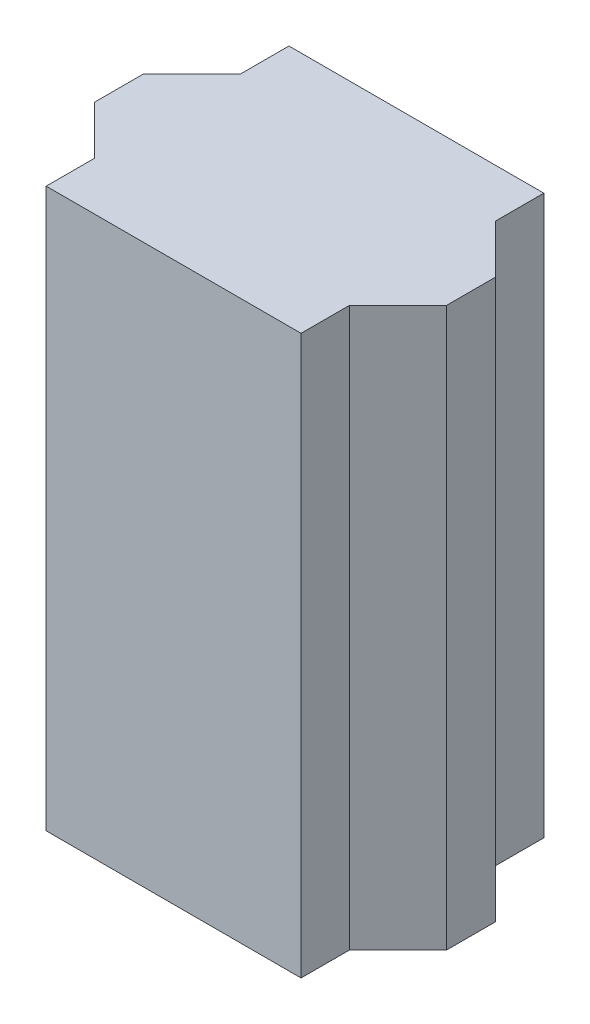
ISO-10303-21;
HEADER;
FILE_DESCRIPTION(('STEP AP214'),'2;1');
FILE_NAME('part.step','',(''),(''),'','','');
FILE_SCHEMA(('AUTOMOTIVE_DESIGN { 1 0 10303 214 1 1 1 1 }'));
ENDSEC;
DATA;
#1=APPLICATION_CONTEXT('core data for automotive mechanical design processes');
#2=APPLICATION_PROTOCOL_DEFINITION('international standard','automotive_design',2000,#1);
#3=PRODUCT_CONTEXT('',#1,'mechanical');
#4=PRODUCT('Part','Part','',(#3));
#5=PRODUCT_RELATED_PRODUCT_CATEGORY('part','',(#4));
#6=PRODUCT_DEFINITION_FORMATION('','',#4);
#7=PRODUCT_DEFINITION_CONTEXT('part definition',#1,'design');
#8=PRODUCT_DEFINITION('design','',#6,#7);
#9=PRODUCT_DEFINITION_SHAPE('','',#8);
#10=(LENGTH_UNIT() NAMED_UNIT(*) SI_UNIT(.MILLI.,.METRE.));
#11=(NAMED_UNIT(*) PLANE_ANGLE_UNIT() SI_UNIT($,.RADIAN.));
#12=(NAMED_UNIT(*) SI_UNIT($,.STERADIAN.) SOLID_ANGLE_UNIT());
#13=UNCERTAINTY_MEASURE_WITH_UNIT(LENGTH_MEASURE(1.E-05),#10,'distance_accuracy_value','');
#14=(GEOMETRIC_REPRESENTATION_CONTEXT(3) GLOBAL_UNCERTAINTY_ASSIGNED_CONTEXT((#13)) GLOBAL_UNIT_ASSIGNED_CONTEXT((#10,
#11,#12)) REPRESENTATION_CONTEXT('',''));
#15=CARTESIAN_POINT('',(0.,0.,0.));
#16=DIRECTION('',(0.,0.,1.));
#17=DIRECTION('',(1.,0.,0.));
#18=AXIS2_PLACEMENT_3D('',#15,#16,#17);
#19=CARTESIAN_POINT('',(5.24999999999998,28.,18.));
#20=DIRECTION('',(-1.,0.,0.));
#21=DIRECTION('',(0.,0.,1.));
#22=AXIS2_PLACEMENT_3D('',#19,#20,#21);
#23=PLANE('',#22);
#24=DIRECTION('',(0.,0.,-1.));
#25=VECTOR('',#24,1.);
#26=CARTESIAN_POINT('',(5.24999999999998,5.,18.));
#27=LINE('',#26,#25);
#28=CARTESIAN_POINT('',(5.24999999999998,5.,20.));
#29=VERTEX_POINT('',#28);
#30=CARTESIAN_POINT('',(5.24999999999998,5.,18.));
#31=VERTEX_POINT('',#30);
#32=EDGE_CURVE('E153',#29,#31,#27,.T.);
#33=ORIENTED_EDGE('',*,*,#32,.T.);
#34=DIRECTION('',(0.,-1.,0.));
#35=VECTOR('',#34,1.);
#36=CARTESIAN_POINT('',(5.24999999999998,28.,18.));
#37=LINE('',#36,#35);
#38=CARTESIAN_POINT('',(5.24999999999998,28.,18.));
#39=VERTEX_POINT('',#38);
#40=EDGE_CURVE('E11',#39,#31,#37,.T.);
#41=ORIENTED_EDGE('',*,*,#40,.F.);
#42=DIRECTION('',(0.,0.,-1.));
#43=VECTOR('',#42,1.);
#44=CARTESIAN_POINT('',(5.24999999999998,28.,18.));
#45=LINE('',#44,#43);
#46=CARTESIAN_POINT('',(5.24999999999998,28.,20.));
#47=VERTEX_POINT('',#46);
#48=EDGE_CURVE('E175',#47,#39,#45,.T.);
#49=ORIENTED_EDGE('',*,*,#48,.F.);
#50=DIRECTION('',(0.,-1.,0.));
#51=VECTOR('',#50,1.);
#52=CARTESIAN_POINT('',(5.24999999999998,28.,20.));
#53=LINE('',#52,#51);
#54=EDGE_CURVE('E149',#47,#29,#53,.T.);
#55=ORIENTED_EDGE('',*,*,#54,.T.);
#56=EDGE_LOOP('',(#33,#41,#49,#55));
#57=FACE_BOUND('',#56,.T.);
#58=ADVANCED_FACE('F33',(#57),#23,.F.);
#59=CARTESIAN_POINT('',(-5.25000000000001,28.,18.));
#60=DIRECTION('',(0.,0.,1.));
#61=DIRECTION('',(1.,0.,0.));
#62=AXIS2_PLACEMENT_3D('',#59,#60,#61);
#63=PLANE('',#62);
#64=DIRECTION('',(-1.,0.,0.));
#65=VECTOR('',#64,1.);
#66=CARTESIAN_POINT('',(-5.25000000000001,5.,18.));
#67=LINE('',#66,#65);
#68=CARTESIAN_POINT('',(-5.25000000000001,5.,18.));
#69=VERTEX_POINT('',#68);
#70=EDGE_CURVE('E156',#31,#69,#67,.T.);
#71=ORIENTED_EDGE('',*,*,#70,.T.);
#72=DIRECTION('',(0.,-1.,0.));
#73=VECTOR('',#72,1.);
#74=CARTESIAN_POINT('',(-5.25000000000001,28.,18.));
#75=LINE('',#74,#73);
#76=CARTESIAN_POINT('',(-5.25000000000001,28.,18.));
#77=VERTEX_POINT('',#76);
#78=EDGE_CURVE('E41',#77,#69,#75,.T.);
#79=ORIENTED_EDGE('',*,*,#78,.F.);
#80=DIRECTION('',(-1.,0.,0.));
#81=VECTOR('',#80,1.);
#82=CARTESIAN_POINT('',(-5.25000000000001,28.,18.));
#83=LINE('',#82,#81);
#84=EDGE_CURVE('E104',#39,#77,#83,.T.);
#85=ORIENTED_EDGE('',*,*,#84,.F.);
#86=ORIENTED_EDGE('',*,*,#40,.T.);
#87=EDGE_LOOP('',(#71,#79,#85,#86));
#88=FACE_BOUND('',#87,.T.);
#89=ADVANCED_FACE('F253',(#88),#63,.F.);
#90=CARTESIAN_POINT('',(-5.25,28.,20.));
#91=DIRECTION('',(1.,0.,0.));
#92=DIRECTION('',(0.,0.,-1.));
#93=AXIS2_PLACEMENT_3D('',#90,#91,#92);
#94=PLANE('',#93);
#95=DIRECTION('',(0.,0.,1.));
#96=VECTOR('',#95,1.);
#97=CARTESIAN_POINT('',(-5.25,5.,20.));
#98=LINE('',#97,#96);
#99=CARTESIAN_POINT('',(-5.25,5.,20.));
#100=VERTEX_POINT('',#99);
#101=EDGE_CURVE('E158',#69,#100,#98,.T.);
#102=ORIENTED_EDGE('',*,*,#101,.T.);
#103=DIRECTION('',(0.,-1.,0.));
#104=VECTOR('',#103,1.);
#105=CARTESIAN_POINT('',(-5.25,28.,20.));
#106=LINE('',#105,#104);
#107=CARTESIAN_POINT('',(-5.25,28.,20.));
#108=VERTEX_POINT('',#107);
#109=EDGE_CURVE('E194',#108,#100,#106,.T.);
#110=ORIENTED_EDGE('',*,*,#109,.F.);
#111=DIRECTION('',(0.,0.,1.));
#112=VECTOR('',#111,1.);
#113=CARTESIAN_POINT('',(-5.25,28.,20.));
#114=LINE('',#113,#112);
#115=EDGE_CURVE('E202',#77,#108,#114,.T.);
#116=ORIENTED_EDGE('',*,*,#115,.F.);
#117=ORIENTED_EDGE('',*,*,#78,.T.);
#118=EDGE_LOOP('',(#102,#110,#116,#117));
#119=FACE_BOUND('',#118,.T.);
#120=ADVANCED_FACE('F200',(#119),#94,.F.);
#121=CARTESIAN_POINT('',(-7.25,28.,22.));
#122=DIRECTION('',(0.70710678118655,0.,0.707106781186545));
#123=DIRECTION('',(0.707106781186545,0.,-0.70710678118655));
#124=AXIS2_PLACEMENT_3D('',#121,#122,#123);
#125=PLANE('',#124);
#126=DIRECTION('',(-0.707106781186545,0.,0.70710678118655));
#127=VECTOR('',#126,1.);
#128=CARTESIAN_POINT('',(-7.25,5.,22.));
#129=LINE('',#128,#127);
#130=CARTESIAN_POINT('',(-7.25,5.,22.));
#131=VERTEX_POINT('',#130);
#132=EDGE_CURVE('E160',#100,#131,#129,.T.);
#133=ORIENTED_EDGE('',*,*,#132,.T.);
#134=DIRECTION('',(0.,-1.,0.));
#135=VECTOR('',#134,1.);
#136=CARTESIAN_POINT('',(-7.25,28.,22.));
#137=LINE('',#136,#135);
#138=CARTESIAN_POINT('',(-7.25,28.,22.));
#139=VERTEX_POINT('',#138);
#140=EDGE_CURVE('E191',#139,#131,#137,.T.);
#141=ORIENTED_EDGE('',*,*,#140,.F.);
#142=DIRECTION('',(-0.707106781186545,0.,0.70710678118655));
#143=VECTOR('',#142,1.);
#144=CARTESIAN_POINT('',(-7.25,28.,22.));
#145=LINE('',#144,#143);
#146=EDGE_CURVE('E220',#108,#139,#145,.T.);
#147=ORIENTED_EDGE('',*,*,#146,.F.);
#148=ORIENTED_EDGE('',*,*,#109,.T.);
#149=EDGE_LOOP('',(#133,#141,#147,#148));
#150=FACE_BOUND('',#149,.T.);
#151=ADVANCED_FACE('F211',(#150),#125,.F.);
#152=CARTESIAN_POINT('',(-7.25,28.,24.));
#153=DIRECTION('',(1.,0.,0.));
#154=DIRECTION('',(0.,0.,-1.));
#155=AXIS2_PLACEMENT_3D('',#152,#153,#154);
#156=PLANE('',#155);
#157=DIRECTION('',(0.,0.,1.));
#158=VECTOR('',#157,1.);
#159=CARTESIAN_POINT('',(-7.25,5.,24.));
#160=LINE('',#159,#158);
#161=CARTESIAN_POINT('',(-7.25,5.,24.));
#162=VERTEX_POINT('',#161);
#163=EDGE_CURVE('E162',#131,#162,#160,.T.);
#164=ORIENTED_EDGE('',*,*,#163,.T.);
#165=DIRECTION('',(0.,-1.,0.));
#166=VECTOR('',#165,1.);
#167=CARTESIAN_POINT('',(-7.25,28.,24.));
#168=LINE('',#167,#166);
#169=CARTESIAN_POINT('',(-7.25,28.,24.));
#170=VERTEX_POINT('',#169);
#171=EDGE_CURVE('E188',#170,#162,#168,.T.);
#172=ORIENTED_EDGE('',*,*,#171,.F.);
#173=DIRECTION('',(0.,0.,1.));
#174=VECTOR('',#173,1.);
#175=CARTESIAN_POINT('',(-7.25,28.,24.));
#176=LINE('',#175,#174);
#177=EDGE_CURVE('E217',#139,#170,#176,.T.);
#178=ORIENTED_EDGE('',*,*,#177,.F.);
#179=ORIENTED_EDGE('',*,*,#140,.T.);
#180=EDGE_LOOP('',(#164,#172,#178,#179));
#181=FACE_BOUND('',#180,.T.);
#182=ADVANCED_FACE('F215',(#181),#156,.F.);
#183=CARTESIAN_POINT('',(-5.25,28.,26.));
#184=DIRECTION('',(0.707106781186544,0.,-0.707106781186551));
#185=DIRECTION('',(-0.707106781186551,0.,-0.707106781186544));
#186=AXIS2_PLACEMENT_3D('',#183,#184,#185);
#187=PLANE('',#186);
#188=DIRECTION('',(0.707106781186551,0.,0.707106781186544));
#189=VECTOR('',#188,1.);
#190=CARTESIAN_POINT('',(-5.25,5.,26.));
#191=LINE('',#190,#189);
#192=CARTESIAN_POINT('',(-5.25,5.,26.));
#193=VERTEX_POINT('',#192);
#194=EDGE_CURVE('E164',#162,#193,#191,.T.);
#195=ORIENTED_EDGE('',*,*,#194,.T.);
#196=DIRECTION('',(0.,-1.,0.));
#197=VECTOR('',#196,1.);
#198=CARTESIAN_POINT('',(-5.25,28.,26.));
#199=LINE('',#198,#197);
#200=CARTESIAN_POINT('',(-5.25,28.,26.));
#201=VERTEX_POINT('',#200);
#202=EDGE_CURVE('E185',#201,#193,#199,.T.);
#203=ORIENTED_EDGE('',*,*,#202,.F.);
#204=DIRECTION('',(0.707106781186551,0.,0.707106781186544));
#205=VECTOR('',#204,1.);
#206=CARTESIAN_POINT('',(-5.25,28.,26.));
#207=LINE('',#206,#205);
#208=EDGE_CURVE('E219',#170,#201,#207,.T.);
#209=ORIENTED_EDGE('',*,*,#208,.F.);
#210=ORIENTED_EDGE('',*,*,#171,.T.);
#211=EDGE_LOOP('',(#195,#203,#209,#210));
#212=FACE_BOUND('',#211,.T.);
#213=ADVANCED_FACE('F266',(#212),#187,.F.);
#214=CARTESIAN_POINT('',(-5.25,28.,28.));
#215=DIRECTION('',(1.,0.,0.));
#216=DIRECTION('',(0.,0.,-1.));
#217=AXIS2_PLACEMENT_3D('',#214,#215,#216);
#218=PLANE('',#217);
#219=DIRECTION('',(0.,0.,1.));
#220=VECTOR('',#219,1.);
#221=CARTESIAN_POINT('',(-5.25,5.,28.));
#222=LINE('',#221,#220);
#223=CARTESIAN_POINT('',(-5.25,5.,28.));
#224=VERTEX_POINT('',#223);
#225=EDGE_CURVE('E166',#193,#224,#222,.T.);
#226=ORIENTED_EDGE('',*,*,#225,.T.);
#227=DIRECTION('',(0.,-1.,0.));
#228=VECTOR('',#227,1.);
#229=CARTESIAN_POINT('',(-5.25,28.,28.));
#230=LINE('',#229,#228);
#231=CARTESIAN_POINT('',(-5.25,28.,28.));
#232=VERTEX_POINT('',#231);
#233=EDGE_CURVE('E182',#232,#224,#230,.T.);
#234=ORIENTED_EDGE('',*,*,#233,.F.);
#235=DIRECTION('',(0.,0.,1.));
#236=VECTOR('',#235,1.);
#237=CARTESIAN_POINT('',(-5.25,28.,28.));
#238=LINE('',#237,#236);
#239=EDGE_CURVE('E222',#201,#232,#238,.T.);
#240=ORIENTED_EDGE('',*,*,#239,.F.);
#241=ORIENTED_EDGE('',*,*,#202,.T.);
#242=EDGE_LOOP('',(#226,#234,#240,#241));
#243=FACE_BOUND('',#242,.T.);
#244=ADVANCED_FACE('F269',(#243),#218,.F.);
#245=CARTESIAN_POINT('',(5.24999999999998,28.,28.));
#246=DIRECTION('',(0.,0.,-1.));
#247=DIRECTION('',(-1.,0.,0.));
#248=AXIS2_PLACEMENT_3D('',#245,#246,#247);
#249=PLANE('',#248);
#250=DIRECTION('',(1.,0.,0.));
#251=VECTOR('',#250,1.);
#252=CARTESIAN_POINT('',(5.24999999999998,5.,28.));
#253=LINE('',#252,#251);
#254=CARTESIAN_POINT('',(5.24999999999998,5.,28.));
#255=VERTEX_POINT('',#254);
#256=EDGE_CURVE('E168',#224,#255,#253,.T.);
#257=ORIENTED_EDGE('',*,*,#256,.T.);
#258=DIRECTION('',(0.,-1.,0.));
#259=VECTOR('',#258,1.);
#260=CARTESIAN_POINT('',(5.24999999999998,28.,28.));
#261=LINE('',#260,#259);
#262=CARTESIAN_POINT('',(5.24999999999998,28.,28.));
#263=VERTEX_POINT('',#262);
#264=EDGE_CURVE('E179',#263,#255,#261,.T.);
#265=ORIENTED_EDGE('',*,*,#264,.F.);
#266=DIRECTION('',(1.,0.,0.));
#267=VECTOR('',#266,1.);
#268=CARTESIAN_POINT('',(5.24999999999998,28.,28.));
#269=LINE('',#268,#267);
#270=EDGE_CURVE('E228',#232,#263,#269,.T.);
#271=ORIENTED_EDGE('',*,*,#270,.F.);
#272=ORIENTED_EDGE('',*,*,#233,.T.);
#273=EDGE_LOOP('',(#257,#265,#271,#272));
#274=FACE_BOUND('',#273,.T.);
#275=ADVANCED_FACE('F234',(#274),#249,.F.);
#276=CARTESIAN_POINT('',(5.24999999999998,28.,26.));
#277=DIRECTION('',(-1.,0.,0.));
#278=DIRECTION('',(0.,0.,1.));
#279=AXIS2_PLACEMENT_3D('',#276,#277,#278);
#280=PLANE('',#279);
#281=DIRECTION('',(0.,0.,-1.));
#282=VECTOR('',#281,1.);
#283=CARTESIAN_POINT('',(5.24999999999998,5.,26.));
#284=LINE('',#283,#282);
#285=CARTESIAN_POINT('',(5.24999999999998,5.,26.));
#286=VERTEX_POINT('',#285);
#287=EDGE_CURVE('E170',#255,#286,#284,.T.);
#288=ORIENTED_EDGE('',*,*,#287,.T.);
#289=DIRECTION('',(0.,-1.,0.));
#290=VECTOR('',#289,1.);
#291=CARTESIAN_POINT('',(5.24999999999998,28.,26.));
#292=LINE('',#291,#290);
#293=CARTESIAN_POINT('',(5.24999999999998,28.,26.));
#294=VERTEX_POINT('',#293);
#295=EDGE_CURVE('E144',#294,#286,#292,.T.);
#296=ORIENTED_EDGE('',*,*,#295,.F.);
#297=DIRECTION('',(0.,0.,-1.));
#298=VECTOR('',#297,1.);
#299=CARTESIAN_POINT('',(5.24999999999998,28.,26.));
#300=LINE('',#299,#298);
#301=EDGE_CURVE('E135',#263,#294,#300,.T.);
#302=ORIENTED_EDGE('',*,*,#301,.F.);
#303=ORIENTED_EDGE('',*,*,#264,.T.);
#304=EDGE_LOOP('',(#288,#296,#302,#303));
#305=FACE_BOUND('',#304,.T.);
#306=ADVANCED_FACE('F238',(#305),#280,.F.);
#307=CARTESIAN_POINT('',(7.25,28.,24.));
#308=DIRECTION('',(-0.707106781186542,0.,-0.707106781186553));
#309=DIRECTION('',(-0.707106781186553,0.,0.707106781186542));
#310=AXIS2_PLACEMENT_3D('',#307,#308,#309);
#311=PLANE('',#310);
#312=DIRECTION('',(0.707106781186553,0.,-0.707106781186542));
#313=VECTOR('',#312,1.);
#314=CARTESIAN_POINT('',(7.25,5.,24.));
#315=LINE('',#314,#313);
#316=CARTESIAN_POINT('',(7.25,5.,24.));
#317=VERTEX_POINT('',#316);
#318=EDGE_CURVE('E143',#286,#317,#315,.T.);
#319=ORIENTED_EDGE('',*,*,#318,.T.);
#320=DIRECTION('',(0.,-1.,0.));
#321=VECTOR('',#320,1.);
#322=CARTESIAN_POINT('',(7.25,28.,24.));
#323=LINE('',#322,#321);
#324=CARTESIAN_POINT('',(7.25,28.,24.));
#325=VERTEX_POINT('',#324);
#326=EDGE_CURVE('E140',#325,#317,#323,.T.);
#327=ORIENTED_EDGE('',*,*,#326,.F.);
#328=DIRECTION('',(0.707106781186553,0.,-0.707106781186542));
#329=VECTOR('',#328,1.);
#330=CARTESIAN_POINT('',(7.25,28.,24.));
#331=LINE('',#330,#329);
#332=EDGE_CURVE('E129',#294,#325,#331,.T.);
#333=ORIENTED_EDGE('',*,*,#332,.F.);
#334=ORIENTED_EDGE('',*,*,#295,.T.);
#335=EDGE_LOOP('',(#319,#327,#333,#334));
#336=FACE_BOUND('',#335,.T.);
#337=ADVANCED_FACE('F141',(#336),#311,.F.);
#338=CARTESIAN_POINT('',(7.25,28.,22.));
#339=DIRECTION('',(-1.,0.,0.));
#340=DIRECTION('',(0.,0.,1.));
#341=AXIS2_PLACEMENT_3D('',#338,#339,#340);
#342=PLANE('',#341);
#343=DIRECTION('',(0.,0.,-1.));
#344=VECTOR('',#343,1.);
#345=CARTESIAN_POINT('',(7.25,5.,22.));
#346=LINE('',#345,#344);
#347=CARTESIAN_POINT('',(7.25,5.,22.));
#348=VERTEX_POINT('',#347);
#349=EDGE_CURVE('E90',#317,#348,#346,.T.);
#350=ORIENTED_EDGE('',*,*,#349,.T.);
#351=DIRECTION('',(0.,-1.,0.));
#352=VECTOR('',#351,1.);
#353=CARTESIAN_POINT('',(7.25,28.,22.));
#354=LINE('',#353,#352);
#355=CARTESIAN_POINT('',(7.25,28.,22.));
#356=VERTEX_POINT('',#355);
#357=EDGE_CURVE('E145',#356,#348,#354,.T.);
#358=ORIENTED_EDGE('',*,*,#357,.F.);
#359=DIRECTION('',(0.,0.,-1.));
#360=VECTOR('',#359,1.);
#361=CARTESIAN_POINT('',(7.25,28.,22.));
#362=LINE('',#361,#360);
#363=EDGE_CURVE('E133',#325,#356,#362,.T.);
#364=ORIENTED_EDGE('',*,*,#363,.F.);
#365=ORIENTED_EDGE('',*,*,#326,.T.);
#366=EDGE_LOOP('',(#350,#358,#364,#365));
#367=FACE_BOUND('',#366,.T.);
#368=ADVANCED_FACE('F147',(#367),#342,.F.);
#369=CARTESIAN_POINT('',(5.24999999999998,28.,20.));
#370=DIRECTION('',(-0.707106781186543,0.,0.707106781186552));
#371=DIRECTION('',(0.707106781186552,0.,0.707106781186543));
#372=AXIS2_PLACEMENT_3D('',#369,#370,#371);
#373=PLANE('',#372);
#374=DIRECTION('',(-0.707106781186553,0.,-0.707106781186543));
#375=VECTOR('',#374,1.);
#376=CARTESIAN_POINT('',(5.24999999999998,5.,20.));
#377=LINE('',#376,#375);
#378=EDGE_CURVE('E96',#348,#29,#377,.T.);
#379=ORIENTED_EDGE('',*,*,#378,.T.);
#380=ORIENTED_EDGE('',*,*,#54,.F.);
#381=DIRECTION('',(-0.707106781186553,0.,-0.707106781186543));
#382=VECTOR('',#381,1.);
#383=CARTESIAN_POINT('',(5.24999999999998,28.,20.));
#384=LINE('',#383,#382);
#385=EDGE_CURVE('E49',#356,#47,#384,.T.);
#386=ORIENTED_EDGE('',*,*,#385,.F.);
#387=ORIENTED_EDGE('',*,*,#357,.T.);
#388=EDGE_LOOP('',(#379,#380,#386,#387));
#389=FACE_BOUND('',#388,.T.);
#390=ADVANCED_FACE('F242',(#389),#373,.F.);
#391=CARTESIAN_POINT('',(0.,28.,0.));
#392=DIRECTION('',(0.,-1.,0.));
#393=DIRECTION('',(0.,0.,-1.));
#394=AXIS2_PLACEMENT_3D('',#391,#392,#393);
#395=PLANE('',#394);
#396=ORIENTED_EDGE('',*,*,#48,.T.);
#397=ORIENTED_EDGE('',*,*,#84,.T.);
#398=ORIENTED_EDGE('',*,*,#115,.T.);
#399=ORIENTED_EDGE('',*,*,#146,.T.);
#400=ORIENTED_EDGE('',*,*,#177,.T.);
#401=ORIENTED_EDGE('',*,*,#208,.T.);
#402=ORIENTED_EDGE('',*,*,#239,.T.);
#403=ORIENTED_EDGE('',*,*,#270,.T.);
#404=ORIENTED_EDGE('',*,*,#301,.T.);
#405=ORIENTED_EDGE('',*,*,#332,.T.);
#406=ORIENTED_EDGE('',*,*,#363,.T.);
#407=ORIENTED_EDGE('',*,*,#385,.T.);
#408=EDGE_LOOP('',(#396,#397,#398,#399,#400,#401,#402,#403,#404,#405,#406,#407));
#409=FACE_BOUND('',#408,.T.);
#410=ADVANCED_FACE('F131',(#409),#395,.F.);
#411=CARTESIAN_POINT('',(0.,5.,0.));
#412=DIRECTION('',(0.,-1.,0.));
#413=DIRECTION('',(0.,0.,-1.));
#414=AXIS2_PLACEMENT_3D('',#411,#412,#413);
#415=PLANE('',#414);
#416=ORIENTED_EDGE('',*,*,#32,.F.);
#417=ORIENTED_EDGE('',*,*,#378,.F.);
#418=ORIENTED_EDGE('',*,*,#349,.F.);
#419=ORIENTED_EDGE('',*,*,#318,.F.);
#420=ORIENTED_EDGE('',*,*,#287,.F.);
#421=ORIENTED_EDGE('',*,*,#256,.F.);
#422=ORIENTED_EDGE('',*,*,#225,.F.);
#423=ORIENTED_EDGE('',*,*,#194,.F.);
#424=ORIENTED_EDGE('',*,*,#163,.F.);
#425=ORIENTED_EDGE('',*,*,#132,.F.);
#426=ORIENTED_EDGE('',*,*,#101,.F.);
#427=ORIENTED_EDGE('',*,*,#70,.F.);
#428=EDGE_LOOP('',(#416,#417,#418,#419,#420,#421,#422,#423,#424,#425,#426,#427));
#429=FACE_BOUND('',#428,.T.);
#430=ADVANCED_FACE('F206',(#429),#415,.T.);
#431=CLOSED_SHELL('',(#58,#89,#120,#151,#182,#213,#244,#275,#306,#337,#368,#390,#410,#430));
#432=MANIFOLD_SOLID_BREP('B2',#431);
#433=ADVANCED_BREP_SHAPE_REPRESENTATION('',(#18,#432),#14);
#434=SHAPE_DEFINITION_REPRESENTATION(#9,#433);
ENDSEC;
END-ISO-10303-21;
